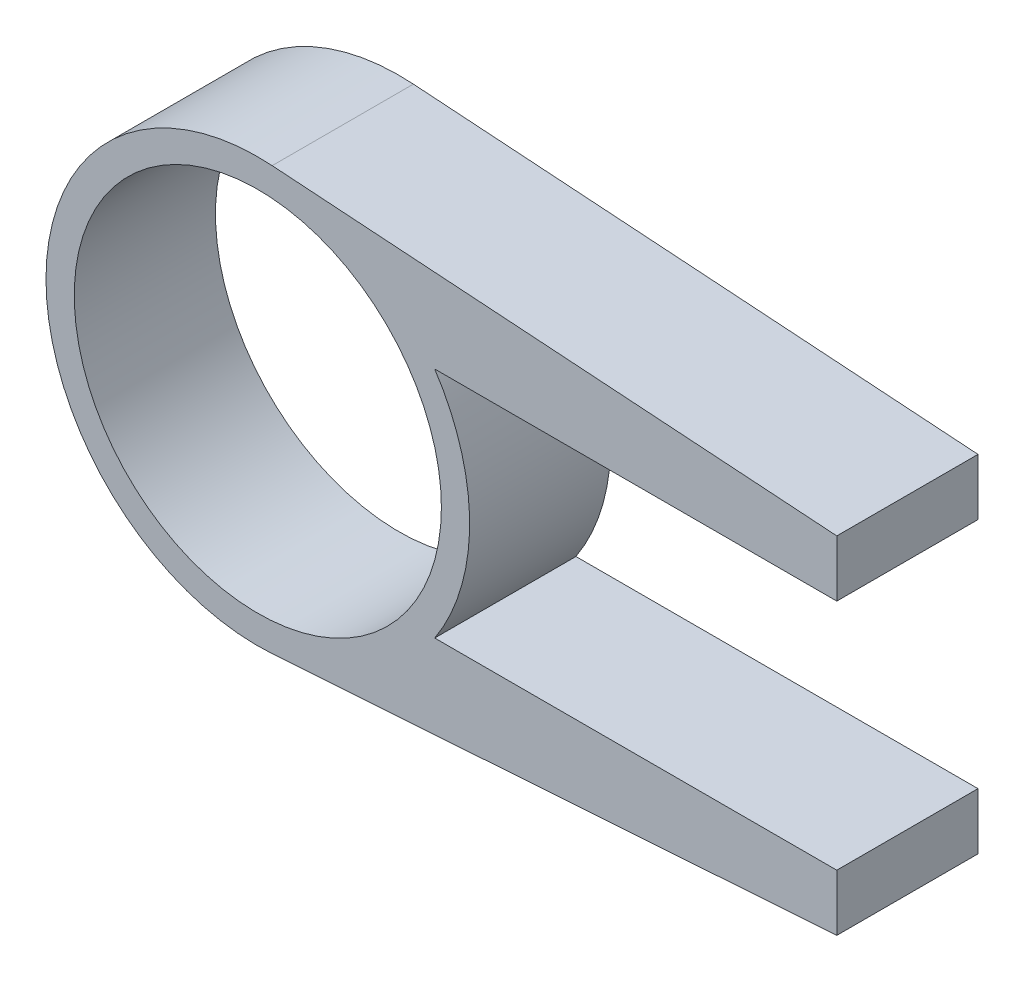
ISO-10303-21;
HEADER;
FILE_DESCRIPTION(('STEP AP214'),'2;1');
FILE_NAME('part.step','',(''),(''),'','','');
FILE_SCHEMA(('AUTOMOTIVE_DESIGN { 1 0 10303 214 1 1 1 1 }'));
ENDSEC;
DATA;
#1=APPLICATION_CONTEXT('core data for automotive mechanical design processes');
#2=APPLICATION_PROTOCOL_DEFINITION('international standard','automotive_design',2000,#1);
#3=PRODUCT_CONTEXT('',#1,'mechanical');
#4=PRODUCT('Part','Part','',(#3));
#5=PRODUCT_RELATED_PRODUCT_CATEGORY('part','',(#4));
#6=PRODUCT_DEFINITION_FORMATION('','',#4);
#7=PRODUCT_DEFINITION_CONTEXT('part definition',#1,'design');
#8=PRODUCT_DEFINITION('design','',#6,#7);
#9=PRODUCT_DEFINITION_SHAPE('','',#8);
#10=(LENGTH_UNIT() NAMED_UNIT(*) SI_UNIT(.MILLI.,.METRE.));
#11=(NAMED_UNIT(*) PLANE_ANGLE_UNIT() SI_UNIT($,.RADIAN.));
#12=(NAMED_UNIT(*) SI_UNIT($,.STERADIAN.) SOLID_ANGLE_UNIT());
#13=UNCERTAINTY_MEASURE_WITH_UNIT(LENGTH_MEASURE(1.E-05),#10,'distance_accuracy_value','');
#14=(GEOMETRIC_REPRESENTATION_CONTEXT(3) GLOBAL_UNCERTAINTY_ASSIGNED_CONTEXT((#13)) GLOBAL_UNIT_ASSIGNED_CONTEXT((#10,
#11,#12)) REPRESENTATION_CONTEXT('',''));
#15=CARTESIAN_POINT('',(0.,0.,0.));
#16=DIRECTION('',(0.,0.,1.));
#17=DIRECTION('',(1.,0.,0.));
#18=AXIS2_PLACEMENT_3D('',#15,#16,#17);
#19=CARTESIAN_POINT('',(0.,0.,-31.75));
#20=DIRECTION('',(0.,0.,1.));
#21=DIRECTION('',(1.,0.,0.));
#22=AXIS2_PLACEMENT_3D('',#19,#20,#21);
#23=CYLINDRICAL_SURFACE('',#22,95.25);
#24=DIRECTION('',(0.,0.,1.));
#25=VECTOR('',#24,1.);
#26=CARTESIAN_POINT('',(79.5494333339339,52.3875,-31.75));
#27=LINE('',#26,#25);
#28=CARTESIAN_POINT('',(79.5494333339339,52.3875,-31.75));
#29=VERTEX_POINT('',#28);
#30=CARTESIAN_POINT('',(79.5494333339339,52.3875,31.75));
#31=VERTEX_POINT('',#30);
#32=EDGE_CURVE('E36',#29,#31,#27,.T.);
#33=ORIENTED_EDGE('',*,*,#32,.T.);
#34=CARTESIAN_POINT('',(0.,0.,31.75));
#35=DIRECTION('',(0.,0.,1.));
#36=DIRECTION('',(1.,0.,0.));
#37=AXIS2_PLACEMENT_3D('',#34,#35,#36);
#38=CIRCLE('',#37,95.25);
#39=CARTESIAN_POINT('',(79.5494333339339,-52.3875,31.75));
#40=VERTEX_POINT('',#39);
#41=EDGE_CURVE('E97',#40,#31,#38,.T.);
#42=ORIENTED_EDGE('',*,*,#41,.F.);
#43=DIRECTION('',(0.,0.,1.));
#44=VECTOR('',#43,1.);
#45=CARTESIAN_POINT('',(79.5494333339339,-52.3875,-31.75));
#46=LINE('',#45,#44);
#47=CARTESIAN_POINT('',(79.5494333339339,-52.3875,-31.75));
#48=VERTEX_POINT('',#47);
#49=EDGE_CURVE('E11',#48,#40,#46,.T.);
#50=ORIENTED_EDGE('',*,*,#49,.F.);
#51=CARTESIAN_POINT('',(0.,0.,-31.75));
#52=DIRECTION('',(0.,0.,1.));
#53=DIRECTION('',(1.,0.,0.));
#54=AXIS2_PLACEMENT_3D('',#51,#52,#53);
#55=CIRCLE('',#54,95.25);
#56=EDGE_CURVE('E98',#48,#29,#55,.T.);
#57=ORIENTED_EDGE('',*,*,#56,.T.);
#58=EDGE_LOOP('',(#33,#42,#50,#57));
#59=FACE_BOUND('',#58,.T.);
#60=ADVANCED_FACE('F33',(#59),#23,.T.);
#61=CARTESIAN_POINT('',(79.5494333339339,-52.3875,-31.75));
#62=DIRECTION('',(0.,1.,0.));
#63=DIRECTION('',(0.,0.,1.));
#64=AXIS2_PLACEMENT_3D('',#61,#62,#63);
#65=PLANE('',#64);
#66=ORIENTED_EDGE('',*,*,#49,.T.);
#67=DIRECTION('',(-1.,0.,0.));
#68=VECTOR('',#67,1.);
#69=CARTESIAN_POINT('',(79.5494333339339,-52.3875,31.75));
#70=LINE('',#69,#68);
#71=CARTESIAN_POINT('',(260.35,-52.3875,31.75));
#72=VERTEX_POINT('',#71);
#73=EDGE_CURVE('E115',#72,#40,#70,.T.);
#74=ORIENTED_EDGE('',*,*,#73,.F.);
#75=DIRECTION('',(0.,0.,1.));
#76=VECTOR('',#75,1.);
#77=CARTESIAN_POINT('',(260.35,-52.3875,-31.75));
#78=LINE('',#77,#76);
#79=CARTESIAN_POINT('',(260.35,-52.3875,-31.75));
#80=VERTEX_POINT('',#79);
#81=EDGE_CURVE('E41',#80,#72,#78,.T.);
#82=ORIENTED_EDGE('',*,*,#81,.F.);
#83=DIRECTION('',(-1.,0.,0.));
#84=VECTOR('',#83,1.);
#85=CARTESIAN_POINT('',(79.5494333339339,-52.3875,-31.75));
#86=LINE('',#85,#84);
#87=EDGE_CURVE('E103',#80,#48,#86,.T.);
#88=ORIENTED_EDGE('',*,*,#87,.T.);
#89=EDGE_LOOP('',(#66,#74,#82,#88));
#90=FACE_BOUND('',#89,.T.);
#91=ADVANCED_FACE('F184',(#90),#65,.T.);
#92=CARTESIAN_POINT('',(260.35,-52.3875,-31.75));
#93=DIRECTION('',(1.,0.,0.));
#94=DIRECTION('',(0.,0.,-1.));
#95=AXIS2_PLACEMENT_3D('',#92,#93,#94);
#96=PLANE('',#95);
#97=ORIENTED_EDGE('',*,*,#81,.T.);
#98=DIRECTION('',(0.,1.,0.));
#99=VECTOR('',#98,1.);
#100=CARTESIAN_POINT('',(260.35,-52.3875,31.75));
#101=LINE('',#100,#99);
#102=CARTESIAN_POINT('',(260.35,-77.7875,31.75));
#103=VERTEX_POINT('',#102);
#104=EDGE_CURVE('E133',#103,#72,#101,.T.);
#105=ORIENTED_EDGE('',*,*,#104,.F.);
#106=DIRECTION('',(0.,0.,1.));
#107=VECTOR('',#106,1.);
#108=CARTESIAN_POINT('',(260.35,-77.7875,-31.75));
#109=LINE('',#108,#107);
#110=CARTESIAN_POINT('',(260.35,-77.7875,-31.75));
#111=VERTEX_POINT('',#110);
#112=EDGE_CURVE('E155',#111,#103,#109,.T.);
#113=ORIENTED_EDGE('',*,*,#112,.F.);
#114=DIRECTION('',(0.,1.,0.));
#115=VECTOR('',#114,1.);
#116=CARTESIAN_POINT('',(260.35,-52.3875,-31.75));
#117=LINE('',#116,#115);
#118=EDGE_CURVE('E151',#111,#80,#117,.T.);
#119=ORIENTED_EDGE('',*,*,#118,.T.);
#120=EDGE_LOOP('',(#97,#105,#113,#119));
#121=FACE_BOUND('',#120,.T.);
#122=ADVANCED_FACE('F183',(#121),#96,.T.);
#123=CARTESIAN_POINT('',(6.45412763984186,-95.0310830013455,-31.75));
#124=DIRECTION('',(0.0677598702345602,-0.997701658806778,0.));
#125=DIRECTION('',(0.997701658806778,0.0677598702345602,0.));
#126=AXIS2_PLACEMENT_3D('',#123,#124,#125);
#127=PLANE('',#126);
#128=ORIENTED_EDGE('',*,*,#112,.T.);
#129=DIRECTION('',(0.997701658806778,0.0677598702345602,0.));
#130=VECTOR('',#129,1.);
#131=CARTESIAN_POINT('',(6.45412763984186,-95.0310830013455,31.75));
#132=LINE('',#131,#130);
#133=CARTESIAN_POINT('',(6.45412763984186,-95.0310830013455,31.75));
#134=VERTEX_POINT('',#133);
#135=EDGE_CURVE('E130',#134,#103,#132,.T.);
#136=ORIENTED_EDGE('',*,*,#135,.F.);
#137=DIRECTION('',(0.,0.,1.));
#138=VECTOR('',#137,1.);
#139=CARTESIAN_POINT('',(6.45412763984186,-95.0310830013455,-31.75));
#140=LINE('',#139,#138);
#141=CARTESIAN_POINT('',(6.45412763984186,-95.0310830013455,-31.75));
#142=VERTEX_POINT('',#141);
#143=EDGE_CURVE('E157',#142,#134,#140,.T.);
#144=ORIENTED_EDGE('',*,*,#143,.F.);
#145=DIRECTION('',(0.997701658806778,0.0677598702345602,0.));
#146=VECTOR('',#145,1.);
#147=CARTESIAN_POINT('',(6.45412763984186,-95.0310830013455,-31.75));
#148=LINE('',#147,#146);
#149=EDGE_CURVE('E148',#142,#111,#148,.T.);
#150=ORIENTED_EDGE('',*,*,#149,.T.);
#151=EDGE_LOOP('',(#128,#136,#144,#150));
#152=FACE_BOUND('',#151,.T.);
#153=ADVANCED_FACE('F179',(#152),#127,.T.);
#154=CARTESIAN_POINT('',(0.,0.,-31.75));
#155=DIRECTION('',(0.,0.,1.));
#156=DIRECTION('',(1.,0.,0.));
#157=AXIS2_PLACEMENT_3D('',#154,#155,#156);
#158=CYLINDRICAL_SURFACE('',#157,95.25);
#159=ORIENTED_EDGE('',*,*,#143,.T.);
#160=CARTESIAN_POINT('',(0.,0.,31.75));
#161=DIRECTION('',(0.,0.,1.));
#162=DIRECTION('',(1.,0.,0.));
#163=AXIS2_PLACEMENT_3D('',#160,#161,#162);
#164=CIRCLE('',#163,95.25);
#165=CARTESIAN_POINT('',(6.45412763984186,95.0310830013455,31.75));
#166=VERTEX_POINT('',#165);
#167=EDGE_CURVE('E127',#166,#134,#164,.T.);
#168=ORIENTED_EDGE('',*,*,#167,.F.);
#169=DIRECTION('',(0.,0.,1.));
#170=VECTOR('',#169,1.);
#171=CARTESIAN_POINT('',(6.45412763984186,95.0310830013455,-31.75));
#172=LINE('',#171,#170);
#173=CARTESIAN_POINT('',(6.45412763984186,95.0310830013455,-31.75));
#174=VERTEX_POINT('',#173);
#175=EDGE_CURVE('E159',#174,#166,#172,.T.);
#176=ORIENTED_EDGE('',*,*,#175,.F.);
#177=CARTESIAN_POINT('',(0.,0.,-31.75));
#178=DIRECTION('',(0.,0.,1.));
#179=DIRECTION('',(1.,0.,0.));
#180=AXIS2_PLACEMENT_3D('',#177,#178,#179);
#181=CIRCLE('',#180,95.25);
#182=EDGE_CURVE('E145',#174,#142,#181,.T.);
#183=ORIENTED_EDGE('',*,*,#182,.T.);
#184=EDGE_LOOP('',(#159,#168,#176,#183));
#185=FACE_BOUND('',#184,.T.);
#186=ADVANCED_FACE('F172',(#185),#158,.T.);
#187=CARTESIAN_POINT('',(6.45412763984186,95.0310830013455,-31.75));
#188=DIRECTION('',(0.0677598702345602,0.997701658806778,0.));
#189=DIRECTION('',(-0.997701658806778,0.0677598702345602,0.));
#190=AXIS2_PLACEMENT_3D('',#187,#188,#189);
#191=PLANE('',#190);
#192=ORIENTED_EDGE('',*,*,#175,.T.);
#193=DIRECTION('',(-0.997701658806778,0.0677598702345602,0.));
#194=VECTOR('',#193,1.);
#195=CARTESIAN_POINT('',(6.45412763984186,95.0310830013455,31.75));
#196=LINE('',#195,#194);
#197=CARTESIAN_POINT('',(260.35,77.7875,31.75));
#198=VERTEX_POINT('',#197);
#199=EDGE_CURVE('E124',#198,#166,#196,.T.);
#200=ORIENTED_EDGE('',*,*,#199,.F.);
#201=DIRECTION('',(0.,0.,1.));
#202=VECTOR('',#201,1.);
#203=CARTESIAN_POINT('',(260.35,77.7875,-31.75));
#204=LINE('',#203,#202);
#205=CARTESIAN_POINT('',(260.35,77.7875,-31.75));
#206=VERTEX_POINT('',#205);
#207=EDGE_CURVE('E161',#206,#198,#204,.T.);
#208=ORIENTED_EDGE('',*,*,#207,.F.);
#209=DIRECTION('',(-0.997701658806778,0.0677598702345602,0.));
#210=VECTOR('',#209,1.);
#211=CARTESIAN_POINT('',(6.45412763984186,95.0310830013455,-31.75));
#212=LINE('',#211,#210);
#213=EDGE_CURVE('E142',#206,#174,#212,.T.);
#214=ORIENTED_EDGE('',*,*,#213,.T.);
#215=EDGE_LOOP('',(#192,#200,#208,#214));
#216=FACE_BOUND('',#215,.T.);
#217=ADVANCED_FACE('F169',(#216),#191,.T.);
#218=CARTESIAN_POINT('',(260.35,52.3875,-31.75));
#219=DIRECTION('',(1.,0.,0.));
#220=DIRECTION('',(0.,1.,0.));
#221=AXIS2_PLACEMENT_3D('',#218,#219,#220);
#222=PLANE('',#221);
#223=ORIENTED_EDGE('',*,*,#207,.T.);
#224=DIRECTION('',(0.,1.,0.));
#225=VECTOR('',#224,1.);
#226=CARTESIAN_POINT('',(260.35,52.3875,31.75));
#227=LINE('',#226,#225);
#228=CARTESIAN_POINT('',(260.35,52.3875,31.75));
#229=VERTEX_POINT('',#228);
#230=EDGE_CURVE('E110',#229,#198,#227,.T.);
#231=ORIENTED_EDGE('',*,*,#230,.F.);
#232=DIRECTION('',(0.,0.,1.));
#233=VECTOR('',#232,1.);
#234=CARTESIAN_POINT('',(260.35,52.3875,-31.75));
#235=LINE('',#234,#233);
#236=CARTESIAN_POINT('',(260.35,52.3875,-31.75));
#237=VERTEX_POINT('',#236);
#238=EDGE_CURVE('E102',#237,#229,#235,.T.);
#239=ORIENTED_EDGE('',*,*,#238,.F.);
#240=DIRECTION('',(0.,1.,0.));
#241=VECTOR('',#240,1.);
#242=CARTESIAN_POINT('',(260.35,52.3875,-31.75));
#243=LINE('',#242,#241);
#244=EDGE_CURVE('E139',#237,#206,#243,.T.);
#245=ORIENTED_EDGE('',*,*,#244,.T.);
#246=EDGE_LOOP('',(#223,#231,#239,#245));
#247=FACE_BOUND('',#246,.T.);
#248=ADVANCED_FACE('F163',(#247),#222,.T.);
#249=CARTESIAN_POINT('',(79.5494333339339,52.3875,-31.75));
#250=DIRECTION('',(0.,-1.,0.));
#251=DIRECTION('',(1.,0.,0.));
#252=AXIS2_PLACEMENT_3D('',#249,#250,#251);
#253=PLANE('',#252);
#254=ORIENTED_EDGE('',*,*,#238,.T.);
#255=DIRECTION('',(1.,0.,0.));
#256=VECTOR('',#255,1.);
#257=CARTESIAN_POINT('',(79.5494333339339,52.3875,31.75));
#258=LINE('',#257,#256);
#259=EDGE_CURVE('E105',#31,#229,#258,.T.);
#260=ORIENTED_EDGE('',*,*,#259,.F.);
#261=ORIENTED_EDGE('',*,*,#32,.F.);
#262=DIRECTION('',(1.,0.,0.));
#263=VECTOR('',#262,1.);
#264=CARTESIAN_POINT('',(79.5494333339339,52.3875,-31.75));
#265=LINE('',#264,#263);
#266=EDGE_CURVE('E137',#29,#237,#265,.T.);
#267=ORIENTED_EDGE('',*,*,#266,.T.);
#268=EDGE_LOOP('',(#254,#260,#261,#267));
#269=FACE_BOUND('',#268,.T.);
#270=ADVANCED_FACE('F106',(#269),#253,.T.);
#271=CARTESIAN_POINT('',(0.,0.,-31.75));
#272=DIRECTION('',(0.,0.,1.));
#273=DIRECTION('',(1.,0.,0.));
#274=AXIS2_PLACEMENT_3D('',#271,#272,#273);
#275=PLANE('',#274);
#276=CARTESIAN_POINT('',(0.,0.,-31.75));
#277=DIRECTION('',(0.,0.,1.));
#278=DIRECTION('',(1.,0.,0.));
#279=AXIS2_PLACEMENT_3D('',#276,#277,#278);
#280=CIRCLE('',#279,82.55);
#281=CARTESIAN_POINT('',(82.55,0.,-31.75));
#282=VERTEX_POINT('',#281);
#283=EDGE_CURVE('E116',#282,#282,#280,.F.);
#284=ORIENTED_EDGE('',*,*,#283,.F.);
#285=EDGE_LOOP('',(#284));
#286=FACE_BOUND('',#285,.T.);
#287=ORIENTED_EDGE('',*,*,#56,.F.);
#288=ORIENTED_EDGE('',*,*,#87,.F.);
#289=ORIENTED_EDGE('',*,*,#118,.F.);
#290=ORIENTED_EDGE('',*,*,#149,.F.);
#291=ORIENTED_EDGE('',*,*,#182,.F.);
#292=ORIENTED_EDGE('',*,*,#213,.F.);
#293=ORIENTED_EDGE('',*,*,#244,.F.);
#294=ORIENTED_EDGE('',*,*,#266,.F.);
#295=EDGE_LOOP('',(#287,#288,#289,#290,#291,#292,#293,#294));
#296=FACE_BOUND('',#295,.T.);
#297=ADVANCED_FACE('F175',(#286,#296),#275,.F.);
#298=CARTESIAN_POINT('',(0.,0.,31.75));
#299=DIRECTION('',(0.,0.,1.));
#300=DIRECTION('',(1.,0.,0.));
#301=AXIS2_PLACEMENT_3D('',#298,#299,#300);
#302=PLANE('',#301);
#303=CARTESIAN_POINT('',(0.,0.,31.75));
#304=DIRECTION('',(0.,0.,1.));
#305=DIRECTION('',(1.,0.,0.));
#306=AXIS2_PLACEMENT_3D('',#303,#304,#305);
#307=CIRCLE('',#306,82.55);
#308=CARTESIAN_POINT('',(82.55,0.,31.75));
#309=VERTEX_POINT('',#308);
#310=EDGE_CURVE('E119',#309,#309,#307,.T.);
#311=ORIENTED_EDGE('',*,*,#310,.F.);
#312=EDGE_LOOP('',(#311));
#313=FACE_BOUND('',#312,.T.);
#314=ORIENTED_EDGE('',*,*,#41,.T.);
#315=ORIENTED_EDGE('',*,*,#259,.T.);
#316=ORIENTED_EDGE('',*,*,#230,.T.);
#317=ORIENTED_EDGE('',*,*,#199,.T.);
#318=ORIENTED_EDGE('',*,*,#167,.T.);
#319=ORIENTED_EDGE('',*,*,#135,.T.);
#320=ORIENTED_EDGE('',*,*,#104,.T.);
#321=ORIENTED_EDGE('',*,*,#73,.T.);
#322=EDGE_LOOP('',(#314,#315,#316,#317,#318,#319,#320,#321));
#323=FACE_BOUND('',#322,.T.);
#324=ADVANCED_FACE('F113',(#313,#323),#302,.T.);
#325=CARTESIAN_POINT('',(0.,0.,-31.751));
#326=DIRECTION('',(0.,0.,1.));
#327=DIRECTION('',(1.,0.,0.));
#328=AXIS2_PLACEMENT_3D('',#325,#326,#327);
#329=CYLINDRICAL_SURFACE('',#328,82.55);
#330=ORIENTED_EDGE('',*,*,#310,.T.);
#331=EDGE_LOOP('',(#330));
#332=FACE_BOUND('',#331,.T.);
#333=ORIENTED_EDGE('',*,*,#283,.T.);
#334=EDGE_LOOP('',(#333));
#335=FACE_BOUND('',#334,.T.);
#336=ADVANCED_FACE('F210',(#332,#335),#329,.F.);
#337=CLOSED_SHELL('',(#60,#91,#122,#153,#186,#217,#248,#270,#297,#324,#336));
#338=MANIFOLD_SOLID_BREP('B2',#337);
#339=ADVANCED_BREP_SHAPE_REPRESENTATION('',(#18,#338),#14);
#340=SHAPE_DEFINITION_REPRESENTATION(#9,#339);
ENDSEC;
END-ISO-10303-21;
